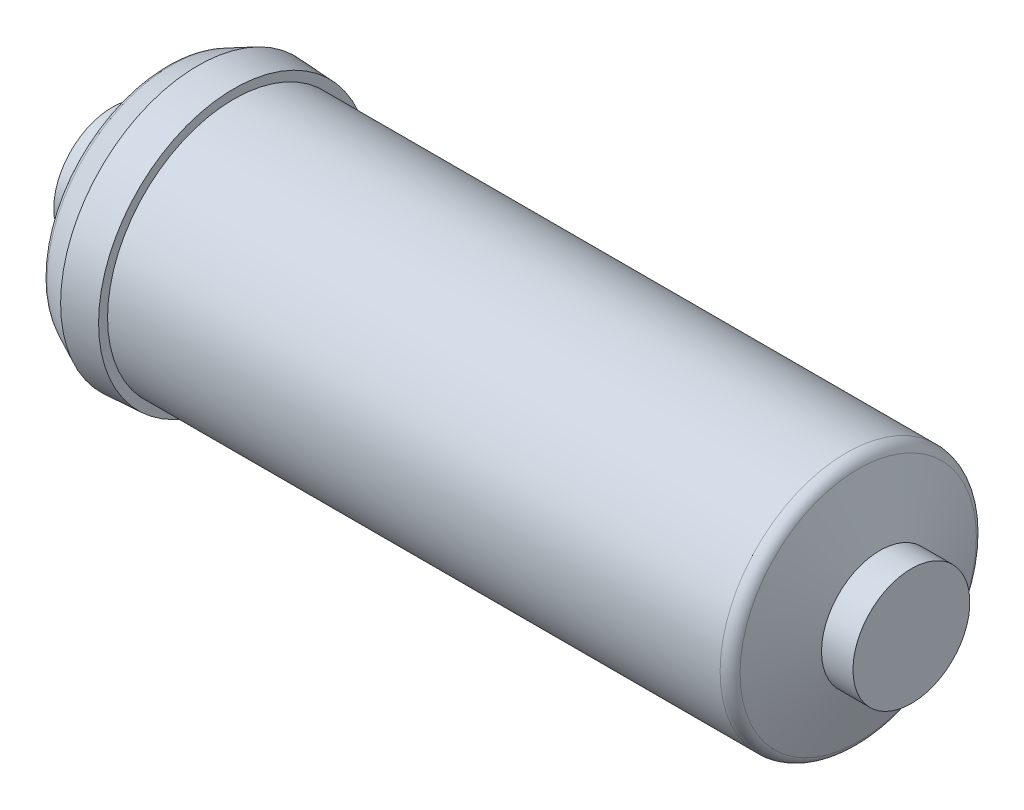
ISO-10303-21;
HEADER;
FILE_DESCRIPTION(('STEP AP214'),'2;1');
FILE_NAME('part.step','',(''),(''),'','','');
FILE_SCHEMA(('AUTOMOTIVE_DESIGN { 1 0 10303 214 1 1 1 1 }'));
ENDSEC;
DATA;
#1=APPLICATION_CONTEXT('core data for automotive mechanical design processes');
#2=APPLICATION_PROTOCOL_DEFINITION('international standard','automotive_design',2000,#1);
#3=PRODUCT_CONTEXT('',#1,'mechanical');
#4=PRODUCT('Part','Part','',(#3));
#5=PRODUCT_RELATED_PRODUCT_CATEGORY('part','',(#4));
#6=PRODUCT_DEFINITION_FORMATION('','',#4);
#7=PRODUCT_DEFINITION_CONTEXT('part definition',#1,'design');
#8=PRODUCT_DEFINITION('design','',#6,#7);
#9=PRODUCT_DEFINITION_SHAPE('','',#8);
#10=(LENGTH_UNIT() NAMED_UNIT(*) SI_UNIT(.MILLI.,.METRE.));
#11=(NAMED_UNIT(*) PLANE_ANGLE_UNIT() SI_UNIT($,.RADIAN.));
#12=(NAMED_UNIT(*) SI_UNIT($,.STERADIAN.) SOLID_ANGLE_UNIT());
#13=UNCERTAINTY_MEASURE_WITH_UNIT(LENGTH_MEASURE(1.E-05),#10,'distance_accuracy_value','');
#14=(GEOMETRIC_REPRESENTATION_CONTEXT(3) GLOBAL_UNCERTAINTY_ASSIGNED_CONTEXT((#13)) GLOBAL_UNIT_ASSIGNED_CONTEXT((#10,
#11,#12)) REPRESENTATION_CONTEXT('',''));
#15=CARTESIAN_POINT('',(0.,0.,0.));
#16=DIRECTION('',(0.,0.,1.));
#17=DIRECTION('',(1.,0.,0.));
#18=AXIS2_PLACEMENT_3D('',#15,#16,#17);
#19=CARTESIAN_POINT('',(0.,0.,0.));
#20=DIRECTION('',(1.,0.,0.));
#21=DIRECTION('',(0.,0.,-1.));
#22=AXIS2_PLACEMENT_3D('',#19,#20,#21);
#23=PLANE('',#22);
#24=CARTESIAN_POINT('',(0.,0.,0.));
#25=DIRECTION('',(-1.,0.,0.));
#26=DIRECTION('',(0.,0.,1.));
#27=AXIS2_PLACEMENT_3D('',#24,#25,#26);
#28=CIRCLE('',#27,14.859);
#29=CARTESIAN_POINT('',(0.,0.,14.859));
#30=VERTEX_POINT('',#29);
#31=EDGE_CURVE('E65',#30,#30,#28,.T.);
#32=ORIENTED_EDGE('',*,*,#31,.T.);
#33=EDGE_LOOP('',(#32));
#34=FACE_BOUND('',#33,.T.);
#35=ADVANCED_FACE('F45',(#34),#23,.F.);
#36=CARTESIAN_POINT('',(0.,0.,0.));
#37=DIRECTION('',(-1.,0.,0.));
#38=DIRECTION('',(0.,0.,1.));
#39=AXIS2_PLACEMENT_3D('',#36,#37,#38);
#40=CYLINDRICAL_SURFACE('',#39,14.859);
#41=ORIENTED_EDGE('',*,*,#31,.F.);
#42=EDGE_LOOP('',(#41));
#43=FACE_BOUND('',#42,.T.);
#44=CARTESIAN_POINT('',(8.001,0.,0.));
#45=DIRECTION('',(-1.,0.,0.));
#46=DIRECTION('',(0.,0.,1.));
#47=AXIS2_PLACEMENT_3D('',#44,#45,#46);
#48=CIRCLE('',#47,14.859);
#49=CARTESIAN_POINT('',(8.001,0.,14.859));
#50=VERTEX_POINT('',#49);
#51=EDGE_CURVE('E68',#50,#50,#48,.T.);
#52=ORIENTED_EDGE('',*,*,#51,.T.);
#53=EDGE_LOOP('',(#52));
#54=FACE_BOUND('',#53,.T.);
#55=ADVANCED_FACE('F105',(#43,#54),#40,.T.);
#56=CARTESIAN_POINT('',(13.9177001282313,0.,0.));
#57=DIRECTION('',(1.,0.,0.));
#58=DIRECTION('',(0.,0.,-1.));
#59=AXIS2_PLACEMENT_3D('',#56,#57,#58);
#60=CONICAL_SURFACE('',#59,31.115,1.22173047639603);
#61=CARTESIAN_POINT('',(13.4769879069627,0.,0.));
#62=DIRECTION('',(-1.,0.,0.));
#63=DIRECTION('',(0.,0.,1.));
#64=AXIS2_PLACEMENT_3D('',#61,#62,#63);
#65=CIRCLE('',#64,29.9041531235868);
#66=CARTESIAN_POINT('',(13.4769879069627,0.,29.9041531235868));
#67=VERTEX_POINT('',#66);
#68=EDGE_CURVE('E52',#67,#67,#65,.T.);
#69=ORIENTED_EDGE('',*,*,#68,.T.);
#70=EDGE_LOOP('',(#69));
#71=FACE_BOUND('',#70,.T.);
#72=ORIENTED_EDGE('',*,*,#51,.F.);
#73=EDGE_LOOP('',(#72));
#74=FACE_BOUND('',#73,.T.);
#75=ADVANCED_FACE('F111',(#71,#74),#60,.T.);
#76=CARTESIAN_POINT('',(21.7917001282313,0.,0.));
#77=DIRECTION('',(1.,0.,0.));
#78=DIRECTION('',(0.,0.,-1.));
#79=AXIS2_PLACEMENT_3D('',#76,#77,#78);
#80=CONICAL_SURFACE('',#79,34.925,0.450661326080633);
#81=CARTESIAN_POINT('',(15.0776060312269,0.,0.));
#82=DIRECTION('',(-1.,0.,0.));
#83=DIRECTION('',(0.,0.,1.));
#84=AXIS2_PLACEMENT_3D('',#81,#82,#83);
#85=CIRCLE('',#84,31.676244791772);
#86=CARTESIAN_POINT('',(15.0776060312269,0.,31.676244791772));
#87=VERTEX_POINT('',#86);
#88=EDGE_CURVE('E10',#87,#87,#85,.F.);
#89=ORIENTED_EDGE('',*,*,#88,.T.);
#90=EDGE_LOOP('',(#89));
#91=FACE_BOUND('',#90,.T.);
#92=CARTESIAN_POINT('',(21.7917001282313,0.,0.));
#93=DIRECTION('',(-1.,0.,0.));
#94=DIRECTION('',(0.,0.,1.));
#95=AXIS2_PLACEMENT_3D('',#92,#93,#94);
#96=CIRCLE('',#95,34.925);
#97=CARTESIAN_POINT('',(21.7917001282313,0.,34.925));
#98=VERTEX_POINT('',#97);
#99=EDGE_CURVE('E71',#98,#98,#96,.T.);
#100=ORIENTED_EDGE('',*,*,#99,.T.);
#101=EDGE_LOOP('',(#100));
#102=FACE_BOUND('',#101,.T.);
#103=ADVANCED_FACE('F117',(#91,#102),#80,.T.);
#104=CARTESIAN_POINT('',(30.9357001282313,0.,0.));
#105=DIRECTION('',(-1.,0.,0.));
#106=DIRECTION('',(0.,0.,1.));
#107=AXIS2_PLACEMENT_3D('',#104,#105,#106);
#108=CONICAL_SURFACE('',#107,34.417,0.0554985052457162);
#109=ORIENTED_EDGE('',*,*,#99,.F.);
#110=EDGE_LOOP('',(#109));
#111=FACE_BOUND('',#110,.T.);
#112=CARTESIAN_POINT('',(30.9357001282313,0.,0.));
#113=DIRECTION('',(-1.,0.,0.));
#114=DIRECTION('',(0.,0.,1.));
#115=AXIS2_PLACEMENT_3D('',#112,#113,#114);
#116=CIRCLE('',#115,34.417);
#117=CARTESIAN_POINT('',(30.9357001282313,0.,34.417));
#118=VERTEX_POINT('',#117);
#119=EDGE_CURVE('E75',#118,#118,#116,.T.);
#120=ORIENTED_EDGE('',*,*,#119,.T.);
#121=EDGE_LOOP('',(#120));
#122=FACE_BOUND('',#121,.T.);
#123=ADVANCED_FACE('F120',(#111,#122),#108,.T.);
#124=CARTESIAN_POINT('',(30.9357001282313,34.417,0.));
#125=DIRECTION('',(-1.,0.,0.));
#126=DIRECTION('',(0.,0.,1.));
#127=AXIS2_PLACEMENT_3D('',#124,#125,#126);
#128=PLANE('',#127);
#129=ORIENTED_EDGE('',*,*,#119,.F.);
#130=EDGE_LOOP('',(#129));
#131=FACE_BOUND('',#130,.T.);
#132=CARTESIAN_POINT('',(30.9357001282313,0.,0.));
#133=DIRECTION('',(-1.,0.,0.));
#134=DIRECTION('',(0.,0.,1.));
#135=AXIS2_PLACEMENT_3D('',#132,#133,#134);
#136=CIRCLE('',#135,32.131);
#137=CARTESIAN_POINT('',(30.9357001282313,0.,32.131));
#138=VERTEX_POINT('',#137);
#139=EDGE_CURVE('E79',#138,#138,#136,.T.);
#140=ORIENTED_EDGE('',*,*,#139,.T.);
#141=EDGE_LOOP('',(#140));
#142=FACE_BOUND('',#141,.T.);
#143=ADVANCED_FACE('F123',(#131,#142),#128,.F.);
#144=CARTESIAN_POINT('',(0.,0.,0.));
#145=DIRECTION('',(-1.,0.,0.));
#146=DIRECTION('',(0.,0.,1.));
#147=AXIS2_PLACEMENT_3D('',#144,#145,#146);
#148=CYLINDRICAL_SURFACE('',#147,32.131);
#149=CARTESIAN_POINT('',(186.689347179938,0.,0.));
#150=DIRECTION('',(1.,0.,0.));
#151=DIRECTION('',(0.,0.,-1.));
#152=AXIS2_PLACEMENT_3D('',#149,#150,#151);
#153=CIRCLE('',#152,32.131);
#154=CARTESIAN_POINT('',(186.689347179938,0.,-32.131));
#155=VERTEX_POINT('',#154);
#156=EDGE_CURVE('E60',#155,#155,#153,.F.);
#157=ORIENTED_EDGE('',*,*,#156,.T.);
#158=EDGE_LOOP('',(#157));
#159=FACE_BOUND('',#158,.T.);
#160=ORIENTED_EDGE('',*,*,#139,.F.);
#161=EDGE_LOOP('',(#160));
#162=FACE_BOUND('',#161,.T.);
#163=ADVANCED_FACE('F127',(#159,#162),#148,.T.);
#164=CARTESIAN_POINT('',(195.199,0.,0.));
#165=DIRECTION('',(-1.,0.,0.));
#166=DIRECTION('',(0.,0.,1.));
#167=AXIS2_PLACEMENT_3D('',#164,#165,#166);
#168=CONICAL_SURFACE('',#167,14.859,1.22173047639603);
#169=CARTESIAN_POINT('',(189.672871250934,0.,0.));
#170=DIRECTION('',(1.,0.,0.));
#171=DIRECTION('',(0.,0.,-1.));
#172=AXIS2_PLACEMENT_3D('',#169,#170,#171);
#173=CIRCLE('',#172,30.041913955059);
#174=CARTESIAN_POINT('',(189.672871250934,0.,-30.041913955059));
#175=VERTEX_POINT('',#174);
#176=EDGE_CURVE('E56',#175,#175,#173,.T.);
#177=ORIENTED_EDGE('',*,*,#176,.T.);
#178=EDGE_LOOP('',(#177));
#179=FACE_BOUND('',#178,.T.);
#180=CARTESIAN_POINT('',(195.199,0.,0.));
#181=DIRECTION('',(-1.,0.,0.));
#182=DIRECTION('',(0.,0.,1.));
#183=AXIS2_PLACEMENT_3D('',#180,#181,#182);
#184=CIRCLE('',#183,14.859);
#185=CARTESIAN_POINT('',(195.199,0.,14.859));
#186=VERTEX_POINT('',#185);
#187=EDGE_CURVE('E83',#186,#186,#184,.T.);
#188=ORIENTED_EDGE('',*,*,#187,.T.);
#189=EDGE_LOOP('',(#188));
#190=FACE_BOUND('',#189,.T.);
#191=ADVANCED_FACE('F101',(#179,#190),#168,.T.);
#192=CARTESIAN_POINT('',(0.,0.,0.));
#193=DIRECTION('',(-1.,0.,0.));
#194=DIRECTION('',(0.,0.,1.));
#195=AXIS2_PLACEMENT_3D('',#192,#193,#194);
#196=CYLINDRICAL_SURFACE('',#195,14.859);
#197=ORIENTED_EDGE('',*,*,#187,.F.);
#198=EDGE_LOOP('',(#197));
#199=FACE_BOUND('',#198,.T.);
#200=CARTESIAN_POINT('',(203.2,0.,0.));
#201=DIRECTION('',(-1.,0.,0.));
#202=DIRECTION('',(0.,0.,1.));
#203=AXIS2_PLACEMENT_3D('',#200,#201,#202);
#204=CIRCLE('',#203,14.859);
#205=CARTESIAN_POINT('',(203.2,0.,14.859));
#206=VERTEX_POINT('',#205);
#207=EDGE_CURVE('E86',#206,#206,#204,.T.);
#208=ORIENTED_EDGE('',*,*,#207,.T.);
#209=EDGE_LOOP('',(#208));
#210=FACE_BOUND('',#209,.T.);
#211=ADVANCED_FACE('F90',(#199,#210),#196,.T.);
#212=CARTESIAN_POINT('',(203.2,14.859,0.));
#213=DIRECTION('',(-1.,0.,0.));
#214=DIRECTION('',(0.,0.,1.));
#215=AXIS2_PLACEMENT_3D('',#212,#213,#214);
#216=PLANE('',#215);
#217=ORIENTED_EDGE('',*,*,#207,.F.);
#218=EDGE_LOOP('',(#217));
#219=FACE_BOUND('',#218,.T.);
#220=ADVANCED_FACE('F92',(#219),#216,.F.);
#221=CARTESIAN_POINT('',(186.689347179938,0.,0.));
#222=DIRECTION('',(1.,0.,0.));
#223=DIRECTION('',(0.,0.,-1.));
#224=AXIS2_PLACEMENT_3D('',#221,#222,#223);
#225=TOROIDAL_SURFACE('',#224,28.956,3.175);
#226=ORIENTED_EDGE('',*,*,#176,.F.);
#227=EDGE_LOOP('',(#226));
#228=FACE_BOUND('',#227,.T.);
#229=ORIENTED_EDGE('',*,*,#156,.F.);
#230=EDGE_LOOP('',(#229));
#231=FACE_BOUND('',#230,.T.);
#232=ADVANCED_FACE('F94',(#228,#231),#225,.T.);
#233=CARTESIAN_POINT('',(16.460511977958,0.,0.));
#234=DIRECTION('',(1.,0.,0.));
#235=DIRECTION('',(0.,0.,-1.));
#236=AXIS2_PLACEMENT_3D('',#233,#234,#235);
#237=TOROIDAL_SURFACE('',#236,28.8182391685278,3.175);
#238=ORIENTED_EDGE('',*,*,#88,.F.);
#239=EDGE_LOOP('',(#238));
#240=FACE_BOUND('',#239,.T.);
#241=ORIENTED_EDGE('',*,*,#68,.F.);
#242=EDGE_LOOP('',(#241));
#243=FACE_BOUND('',#242,.T.);
#244=ADVANCED_FACE('F47',(#240,#243),#237,.T.);
#245=CLOSED_SHELL('',(#35,#55,#75,#103,#123,#143,#163,#191,#211,#220,#232,#244));
#246=MANIFOLD_SOLID_BREP('B2',#245);
#247=ADVANCED_BREP_SHAPE_REPRESENTATION('',(#18,#246),#14);
#248=SHAPE_DEFINITION_REPRESENTATION(#9,#247);
ENDSEC;
END-ISO-10303-21;
